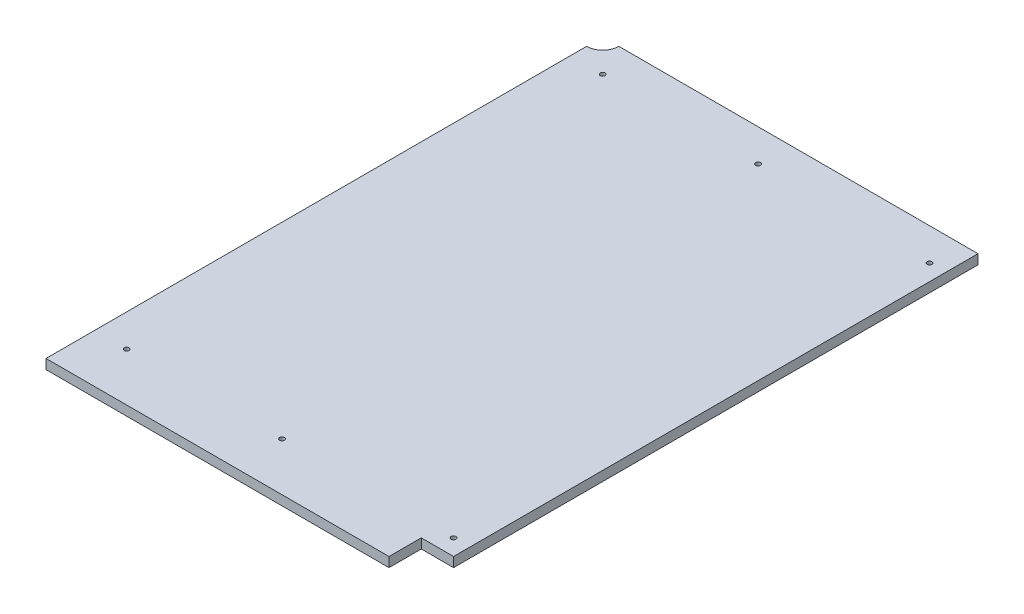
ISO-10303-21;
HEADER;
FILE_DESCRIPTION(('STEP AP214'),'2;1');
FILE_NAME('part.step','',(''),(''),'','','');
FILE_SCHEMA(('AUTOMOTIVE_DESIGN { 1 0 10303 214 1 1 1 1 }'));
ENDSEC;
DATA;
#1=APPLICATION_CONTEXT('core data for automotive mechanical design processes');
#2=APPLICATION_PROTOCOL_DEFINITION('international standard','automotive_design',2000,#1);
#3=PRODUCT_CONTEXT('',#1,'mechanical');
#4=PRODUCT('Part','Part','',(#3));
#5=PRODUCT_RELATED_PRODUCT_CATEGORY('part','',(#4));
#6=PRODUCT_DEFINITION_FORMATION('','',#4);
#7=PRODUCT_DEFINITION_CONTEXT('part definition',#1,'design');
#8=PRODUCT_DEFINITION('design','',#6,#7);
#9=PRODUCT_DEFINITION_SHAPE('','',#8);
#10=(LENGTH_UNIT() NAMED_UNIT(*) SI_UNIT(.MILLI.,.METRE.));
#11=(NAMED_UNIT(*) PLANE_ANGLE_UNIT() SI_UNIT($,.RADIAN.));
#12=(NAMED_UNIT(*) SI_UNIT($,.STERADIAN.) SOLID_ANGLE_UNIT());
#13=UNCERTAINTY_MEASURE_WITH_UNIT(LENGTH_MEASURE(1.E-05),#10,'distance_accuracy_value','');
#14=(GEOMETRIC_REPRESENTATION_CONTEXT(3) GLOBAL_UNCERTAINTY_ASSIGNED_CONTEXT((#13)) GLOBAL_UNIT_ASSIGNED_CONTEXT((#10,
#11,#12)) REPRESENTATION_CONTEXT('',''));
#15=CARTESIAN_POINT('',(0.,0.,0.));
#16=DIRECTION('',(0.,0.,1.));
#17=DIRECTION('',(1.,0.,0.));
#18=AXIS2_PLACEMENT_3D('',#15,#16,#17);
#19=CARTESIAN_POINT('',(-112.725,6.,-113.5));
#20=DIRECTION('',(0.,1.,0.));
#21=DIRECTION('',(0.,0.,1.));
#22=AXIS2_PLACEMENT_3D('',#19,#20,#21);
#23=PLANE('',#22);
#24=CARTESIAN_POINT('',(3.55000000000004,6.,201.5));
#25=DIRECTION('',(0.,1.,0.));
#26=DIRECTION('',(0.,0.,1.));
#27=AXIS2_PLACEMENT_3D('',#24,#25,#26);
#28=CIRCLE('',#27,1.5);
#29=CARTESIAN_POINT('',(3.55000000000004,6.,203.));
#30=VERTEX_POINT('',#29);
#31=EDGE_CURVE('E185',#30,#30,#28,.T.);
#32=ORIENTED_EDGE('',*,*,#31,.F.);
#33=EDGE_LOOP('',(#32));
#34=FACE_BOUND('',#33,.T.);
#35=CARTESIAN_POINT('',(3.55,6.,-93.5));
#36=DIRECTION('',(0.,1.,0.));
#37=DIRECTION('',(0.,0.,1.));
#38=AXIS2_PLACEMENT_3D('',#35,#36,#37);
#39=CIRCLE('',#38,1.5);
#40=CARTESIAN_POINT('',(3.55,6.,-92.));
#41=VERTEX_POINT('',#40);
#42=EDGE_CURVE('E173',#41,#41,#39,.T.);
#43=ORIENTED_EDGE('',*,*,#42,.F.);
#44=EDGE_LOOP('',(#43));
#45=FACE_BOUND('',#44,.T.);
#46=CARTESIAN_POINT('',(-92.725,6.,-93.5));
#47=DIRECTION('',(0.,1.,0.));
#48=DIRECTION('',(0.,0.,1.));
#49=AXIS2_PLACEMENT_3D('',#46,#47,#48);
#50=CIRCLE('',#49,1.5);
#51=CARTESIAN_POINT('',(-92.725,6.,-92.));
#52=VERTEX_POINT('',#51);
#53=EDGE_CURVE('E128',#52,#52,#50,.T.);
#54=ORIENTED_EDGE('',*,*,#53,.F.);
#55=EDGE_LOOP('',(#54));
#56=FACE_BOUND('',#55,.T.);
#57=DIRECTION('',(1.,0.,0.));
#58=VECTOR('',#57,1.);
#59=CARTESIAN_POINT('',(-112.725,6.,231.5));
#60=LINE('',#59,#58);
#61=CARTESIAN_POINT('',(-112.725,6.,231.5));
#62=VERTEX_POINT('',#61);
#63=CARTESIAN_POINT('',(99.825,6.,231.5));
#64=VERTEX_POINT('',#63);
#65=EDGE_CURVE('E87',#62,#64,#60,.T.);
#66=ORIENTED_EDGE('',*,*,#65,.T.);
#67=DIRECTION('',(0.,0.,-1.));
#68=VECTOR('',#67,1.);
#69=CARTESIAN_POINT('',(99.825,6.,231.5));
#70=LINE('',#69,#68);
#71=CARTESIAN_POINT('',(99.825,6.,211.5));
#72=VERTEX_POINT('',#71);
#73=EDGE_CURVE('E159',#64,#72,#70,.T.);
#74=ORIENTED_EDGE('',*,*,#73,.T.);
#75=DIRECTION('',(1.,0.,0.));
#76=VECTOR('',#75,1.);
#77=CARTESIAN_POINT('',(99.825,6.,211.5));
#78=LINE('',#77,#76);
#79=CARTESIAN_POINT('',(119.825,6.,211.5));
#80=VERTEX_POINT('',#79);
#81=EDGE_CURVE('E151',#72,#80,#78,.T.);
#82=ORIENTED_EDGE('',*,*,#81,.T.);
#83=DIRECTION('',(0.,0.,-1.));
#84=VECTOR('',#83,1.);
#85=CARTESIAN_POINT('',(119.825,6.,-113.5));
#86=LINE('',#85,#84);
#87=CARTESIAN_POINT('',(119.825,6.,-113.5));
#88=VERTEX_POINT('',#87);
#89=EDGE_CURVE('E105',#80,#88,#86,.T.);
#90=ORIENTED_EDGE('',*,*,#89,.T.);
#91=DIRECTION('',(-1.,0.,0.));
#92=VECTOR('',#91,1.);
#93=CARTESIAN_POINT('',(-102.725,6.,-113.5));
#94=LINE('',#93,#92);
#95=CARTESIAN_POINT('',(-102.725,6.,-113.5));
#96=VERTEX_POINT('',#95);
#97=EDGE_CURVE('E98',#88,#96,#94,.T.);
#98=ORIENTED_EDGE('',*,*,#97,.T.);
#99=CARTESIAN_POINT('',(-112.725,6.,-113.5));
#100=DIRECTION('',(0.,-1.,0.));
#101=DIRECTION('',(0.,0.,1.));
#102=AXIS2_PLACEMENT_3D('',#99,#100,#101);
#103=CIRCLE('',#102,9.99999999999999);
#104=CARTESIAN_POINT('',(-112.725,6.,-103.5));
#105=VERTEX_POINT('',#104);
#106=EDGE_CURVE('E102',#96,#105,#103,.T.);
#107=ORIENTED_EDGE('',*,*,#106,.T.);
#108=DIRECTION('',(0.,0.,1.));
#109=VECTOR('',#108,1.);
#110=CARTESIAN_POINT('',(-112.725,6.,-103.5));
#111=LINE('',#110,#109);
#112=EDGE_CURVE('E52',#105,#62,#111,.T.);
#113=ORIENTED_EDGE('',*,*,#112,.T.);
#114=EDGE_LOOP('',(#66,#74,#82,#90,#98,#107,#113));
#115=FACE_BOUND('',#114,.T.);
#116=CARTESIAN_POINT('',(109.825,6.,-93.5));
#117=DIRECTION('',(0.,1.,0.));
#118=DIRECTION('',(0.,0.,1.));
#119=AXIS2_PLACEMENT_3D('',#116,#117,#118);
#120=CIRCLE('',#119,1.5);
#121=CARTESIAN_POINT('',(109.825,6.,-92.));
#122=VERTEX_POINT('',#121);
#123=EDGE_CURVE('E167',#122,#122,#120,.T.);
#124=ORIENTED_EDGE('',*,*,#123,.F.);
#125=EDGE_LOOP('',(#124));
#126=FACE_BOUND('',#125,.T.);
#127=CARTESIAN_POINT('',(-92.725,6.,201.5));
#128=DIRECTION('',(0.,1.,0.));
#129=DIRECTION('',(0.,0.,1.));
#130=AXIS2_PLACEMENT_3D('',#127,#128,#129);
#131=CIRCLE('',#130,1.5);
#132=CARTESIAN_POINT('',(-92.725,6.,203.));
#133=VERTEX_POINT('',#132);
#134=EDGE_CURVE('E179',#133,#133,#131,.T.);
#135=ORIENTED_EDGE('',*,*,#134,.F.);
#136=EDGE_LOOP('',(#135));
#137=FACE_BOUND('',#136,.T.);
#138=CARTESIAN_POINT('',(109.825,6.,201.5));
#139=DIRECTION('',(0.,1.,0.));
#140=DIRECTION('',(0.,0.,1.));
#141=AXIS2_PLACEMENT_3D('',#138,#139,#140);
#142=CIRCLE('',#141,1.5);
#143=CARTESIAN_POINT('',(109.825,6.,203.));
#144=VERTEX_POINT('',#143);
#145=EDGE_CURVE('E191',#144,#144,#142,.T.);
#146=ORIENTED_EDGE('',*,*,#145,.F.);
#147=EDGE_LOOP('',(#146));
#148=FACE_BOUND('',#147,.T.);
#149=ADVANCED_FACE('F35',(#34,#45,#56,#115,#126,#137,#148),#23,.T.);
#150=CARTESIAN_POINT('',(-112.725,0.,-113.5));
#151=DIRECTION('',(0.,1.,0.));
#152=DIRECTION('',(0.,0.,1.));
#153=AXIS2_PLACEMENT_3D('',#150,#151,#152);
#154=PLANE('',#153);
#155=DIRECTION('',(1.,0.,0.));
#156=VECTOR('',#155,1.);
#157=CARTESIAN_POINT('',(-102.725,0.,231.5));
#158=LINE('',#157,#156);
#159=CARTESIAN_POINT('',(-112.725,0.,231.5));
#160=VERTEX_POINT('',#159);
#161=CARTESIAN_POINT('',(99.825,0.,231.5));
#162=VERTEX_POINT('',#161);
#163=EDGE_CURVE('E82',#160,#162,#158,.T.);
#164=ORIENTED_EDGE('',*,*,#163,.F.);
#165=DIRECTION('',(0.,0.,1.));
#166=VECTOR('',#165,1.);
#167=CARTESIAN_POINT('',(-112.725,0.,221.5));
#168=LINE('',#167,#166);
#169=CARTESIAN_POINT('',(-112.725,0.,-103.5));
#170=VERTEX_POINT('',#169);
#171=EDGE_CURVE('E78',#170,#160,#168,.T.);
#172=ORIENTED_EDGE('',*,*,#171,.F.);
#173=CARTESIAN_POINT('',(-112.725,0.,-113.5));
#174=DIRECTION('',(0.,-1.,0.));
#175=DIRECTION('',(0.,0.,1.));
#176=AXIS2_PLACEMENT_3D('',#173,#174,#175);
#177=CIRCLE('',#176,9.99999999999999);
#178=CARTESIAN_POINT('',(-102.725,0.,-113.5));
#179=VERTEX_POINT('',#178);
#180=EDGE_CURVE('E135',#179,#170,#177,.T.);
#181=ORIENTED_EDGE('',*,*,#180,.F.);
#182=DIRECTION('',(-1.,0.,0.));
#183=VECTOR('',#182,1.);
#184=CARTESIAN_POINT('',(-102.725,0.,-113.5));
#185=LINE('',#184,#183);
#186=CARTESIAN_POINT('',(119.825,0.,-113.5));
#187=VERTEX_POINT('',#186);
#188=EDGE_CURVE('E114',#187,#179,#185,.T.);
#189=ORIENTED_EDGE('',*,*,#188,.F.);
#190=DIRECTION('',(0.,0.,-1.));
#191=VECTOR('',#190,1.);
#192=CARTESIAN_POINT('',(119.825,0.,-113.5));
#193=LINE('',#192,#191);
#194=CARTESIAN_POINT('',(119.825,0.,211.5));
#195=VERTEX_POINT('',#194);
#196=EDGE_CURVE('E132',#195,#187,#193,.T.);
#197=ORIENTED_EDGE('',*,*,#196,.F.);
#198=DIRECTION('',(1.,0.,0.));
#199=VECTOR('',#198,1.);
#200=CARTESIAN_POINT('',(99.825,0.,211.5));
#201=LINE('',#200,#199);
#202=CARTESIAN_POINT('',(99.825,0.,211.5));
#203=VERTEX_POINT('',#202);
#204=EDGE_CURVE('E130',#203,#195,#201,.T.);
#205=ORIENTED_EDGE('',*,*,#204,.F.);
#206=DIRECTION('',(0.,0.,-1.));
#207=VECTOR('',#206,1.);
#208=CARTESIAN_POINT('',(99.825,0.,231.5));
#209=LINE('',#208,#207);
#210=EDGE_CURVE('E127',#162,#203,#209,.T.);
#211=ORIENTED_EDGE('',*,*,#210,.F.);
#212=EDGE_LOOP('',(#164,#172,#181,#189,#197,#205,#211));
#213=FACE_BOUND('',#212,.T.);
#214=CARTESIAN_POINT('',(-92.725,0.,-93.5));
#215=DIRECTION('',(0.,1.,0.));
#216=DIRECTION('',(0.,0.,1.));
#217=AXIS2_PLACEMENT_3D('',#214,#215,#216);
#218=CIRCLE('',#217,1.5);
#219=CARTESIAN_POINT('',(-92.725,0.,-92.));
#220=VERTEX_POINT('',#219);
#221=EDGE_CURVE('E164',#220,#220,#218,.T.);
#222=ORIENTED_EDGE('',*,*,#221,.T.);
#223=EDGE_LOOP('',(#222));
#224=FACE_BOUND('',#223,.T.);
#225=CARTESIAN_POINT('',(109.825,0.,-93.5));
#226=DIRECTION('',(0.,1.,0.));
#227=DIRECTION('',(0.,0.,1.));
#228=AXIS2_PLACEMENT_3D('',#225,#226,#227);
#229=CIRCLE('',#228,1.5);
#230=CARTESIAN_POINT('',(109.825,0.,-92.));
#231=VERTEX_POINT('',#230);
#232=EDGE_CURVE('E170',#231,#231,#229,.T.);
#233=ORIENTED_EDGE('',*,*,#232,.T.);
#234=EDGE_LOOP('',(#233));
#235=FACE_BOUND('',#234,.T.);
#236=CARTESIAN_POINT('',(3.55,0.,-93.5));
#237=DIRECTION('',(0.,1.,0.));
#238=DIRECTION('',(0.,0.,1.));
#239=AXIS2_PLACEMENT_3D('',#236,#237,#238);
#240=CIRCLE('',#239,1.5);
#241=CARTESIAN_POINT('',(3.55,0.,-92.));
#242=VERTEX_POINT('',#241);
#243=EDGE_CURVE('E176',#242,#242,#240,.T.);
#244=ORIENTED_EDGE('',*,*,#243,.T.);
#245=EDGE_LOOP('',(#244));
#246=FACE_BOUND('',#245,.T.);
#247=CARTESIAN_POINT('',(-92.725,0.,201.5));
#248=DIRECTION('',(0.,1.,0.));
#249=DIRECTION('',(0.,0.,1.));
#250=AXIS2_PLACEMENT_3D('',#247,#248,#249);
#251=CIRCLE('',#250,1.5);
#252=CARTESIAN_POINT('',(-92.725,0.,203.));
#253=VERTEX_POINT('',#252);
#254=EDGE_CURVE('E182',#253,#253,#251,.T.);
#255=ORIENTED_EDGE('',*,*,#254,.T.);
#256=EDGE_LOOP('',(#255));
#257=FACE_BOUND('',#256,.T.);
#258=CARTESIAN_POINT('',(3.55000000000004,0.,201.5));
#259=DIRECTION('',(0.,1.,0.));
#260=DIRECTION('',(0.,0.,1.));
#261=AXIS2_PLACEMENT_3D('',#258,#259,#260);
#262=CIRCLE('',#261,1.5);
#263=CARTESIAN_POINT('',(3.55000000000004,0.,203.));
#264=VERTEX_POINT('',#263);
#265=EDGE_CURVE('E188',#264,#264,#262,.T.);
#266=ORIENTED_EDGE('',*,*,#265,.T.);
#267=EDGE_LOOP('',(#266));
#268=FACE_BOUND('',#267,.T.);
#269=CARTESIAN_POINT('',(109.825,0.,201.5));
#270=DIRECTION('',(0.,1.,0.));
#271=DIRECTION('',(0.,0.,1.));
#272=AXIS2_PLACEMENT_3D('',#269,#270,#271);
#273=CIRCLE('',#272,1.5);
#274=CARTESIAN_POINT('',(109.825,0.,203.));
#275=VERTEX_POINT('',#274);
#276=EDGE_CURVE('E194',#275,#275,#273,.T.);
#277=ORIENTED_EDGE('',*,*,#276,.T.);
#278=EDGE_LOOP('',(#277));
#279=FACE_BOUND('',#278,.T.);
#280=ADVANCED_FACE('F155',(#213,#224,#235,#246,#257,#268,#279),#154,.F.);
#281=CARTESIAN_POINT('',(-102.725,6.,231.5));
#282=DIRECTION('',(0.,0.,-1.));
#283=DIRECTION('',(-1.,0.,0.));
#284=AXIS2_PLACEMENT_3D('',#281,#282,#283);
#285=PLANE('',#284);
#286=ORIENTED_EDGE('',*,*,#163,.T.);
#287=DIRECTION('',(0.,-1.,0.));
#288=VECTOR('',#287,1.);
#289=CARTESIAN_POINT('',(99.825,6.,231.5));
#290=LINE('',#289,#288);
#291=EDGE_CURVE('E11',#64,#162,#290,.T.);
#292=ORIENTED_EDGE('',*,*,#291,.F.);
#293=ORIENTED_EDGE('',*,*,#65,.F.);
#294=DIRECTION('',(0.,-1.,0.));
#295=VECTOR('',#294,1.);
#296=CARTESIAN_POINT('',(-112.725,6.,231.5));
#297=LINE('',#296,#295);
#298=EDGE_CURVE('E122',#62,#160,#297,.T.);
#299=ORIENTED_EDGE('',*,*,#298,.T.);
#300=EDGE_LOOP('',(#286,#292,#293,#299));
#301=FACE_BOUND('',#300,.T.);
#302=ADVANCED_FACE('F37',(#301),#285,.F.);
#303=CARTESIAN_POINT('',(99.825,6.,231.5));
#304=DIRECTION('',(-1.,0.,0.));
#305=DIRECTION('',(0.,0.,1.));
#306=AXIS2_PLACEMENT_3D('',#303,#304,#305);
#307=PLANE('',#306);
#308=ORIENTED_EDGE('',*,*,#210,.T.);
#309=DIRECTION('',(0.,-1.,0.));
#310=VECTOR('',#309,1.);
#311=CARTESIAN_POINT('',(99.825,6.,211.5));
#312=LINE('',#311,#310);
#313=EDGE_CURVE('E44',#72,#203,#312,.T.);
#314=ORIENTED_EDGE('',*,*,#313,.F.);
#315=ORIENTED_EDGE('',*,*,#73,.F.);
#316=ORIENTED_EDGE('',*,*,#291,.T.);
#317=EDGE_LOOP('',(#308,#314,#315,#316));
#318=FACE_BOUND('',#317,.T.);
#319=ADVANCED_FACE('F227',(#318),#307,.F.);
#320=CARTESIAN_POINT('',(99.825,6.,211.5));
#321=DIRECTION('',(0.,0.,-1.));
#322=DIRECTION('',(-1.,0.,0.));
#323=AXIS2_PLACEMENT_3D('',#320,#321,#322);
#324=PLANE('',#323);
#325=ORIENTED_EDGE('',*,*,#204,.T.);
#326=DIRECTION('',(0.,-1.,0.));
#327=VECTOR('',#326,1.);
#328=CARTESIAN_POINT('',(119.825,6.,211.5));
#329=LINE('',#328,#327);
#330=EDGE_CURVE('E142',#80,#195,#329,.T.);
#331=ORIENTED_EDGE('',*,*,#330,.F.);
#332=ORIENTED_EDGE('',*,*,#81,.F.);
#333=ORIENTED_EDGE('',*,*,#313,.T.);
#334=EDGE_LOOP('',(#325,#331,#332,#333));
#335=FACE_BOUND('',#334,.T.);
#336=ADVANCED_FACE('F149',(#335),#324,.F.);
#337=CARTESIAN_POINT('',(119.825,6.,-113.5));
#338=DIRECTION('',(-1.,0.,0.));
#339=DIRECTION('',(0.,0.,1.));
#340=AXIS2_PLACEMENT_3D('',#337,#338,#339);
#341=PLANE('',#340);
#342=ORIENTED_EDGE('',*,*,#196,.T.);
#343=DIRECTION('',(0.,-1.,0.));
#344=VECTOR('',#343,1.);
#345=CARTESIAN_POINT('',(119.825,6.,-113.5));
#346=LINE('',#345,#344);
#347=EDGE_CURVE('E116',#88,#187,#346,.T.);
#348=ORIENTED_EDGE('',*,*,#347,.F.);
#349=ORIENTED_EDGE('',*,*,#89,.F.);
#350=ORIENTED_EDGE('',*,*,#330,.T.);
#351=EDGE_LOOP('',(#342,#348,#349,#350));
#352=FACE_BOUND('',#351,.T.);
#353=ADVANCED_FACE('F158',(#352),#341,.F.);
#354=CARTESIAN_POINT('',(-102.725,6.,-113.5));
#355=DIRECTION('',(0.,0.,1.));
#356=DIRECTION('',(1.,0.,0.));
#357=AXIS2_PLACEMENT_3D('',#354,#355,#356);
#358=PLANE('',#357);
#359=ORIENTED_EDGE('',*,*,#188,.T.);
#360=DIRECTION('',(0.,-1.,0.));
#361=VECTOR('',#360,1.);
#362=CARTESIAN_POINT('',(-102.725,6.,-113.5));
#363=LINE('',#362,#361);
#364=EDGE_CURVE('E111',#96,#179,#363,.T.);
#365=ORIENTED_EDGE('',*,*,#364,.F.);
#366=ORIENTED_EDGE('',*,*,#97,.F.);
#367=ORIENTED_EDGE('',*,*,#347,.T.);
#368=EDGE_LOOP('',(#359,#365,#366,#367));
#369=FACE_BOUND('',#368,.T.);
#370=ADVANCED_FACE('F112',(#369),#358,.F.);
#371=CARTESIAN_POINT('',(-112.725,6.,-113.5));
#372=DIRECTION('',(0.,-1.,0.));
#373=DIRECTION('',(0.,0.,-1.));
#374=AXIS2_PLACEMENT_3D('',#371,#372,#373);
#375=CYLINDRICAL_SURFACE('',#374,9.99999999999999);
#376=ORIENTED_EDGE('',*,*,#180,.T.);
#377=DIRECTION('',(0.,-1.,0.));
#378=VECTOR('',#377,1.);
#379=CARTESIAN_POINT('',(-112.725,6.,-103.5));
#380=LINE('',#379,#378);
#381=EDGE_CURVE('E117',#105,#170,#380,.T.);
#382=ORIENTED_EDGE('',*,*,#381,.F.);
#383=ORIENTED_EDGE('',*,*,#106,.F.);
#384=ORIENTED_EDGE('',*,*,#364,.T.);
#385=EDGE_LOOP('',(#376,#382,#383,#384));
#386=FACE_BOUND('',#385,.T.);
#387=ADVANCED_FACE('F119',(#386),#375,.F.);
#388=CARTESIAN_POINT('',(-112.725,6.,221.5));
#389=DIRECTION('',(1.,0.,0.));
#390=DIRECTION('',(0.,0.,-1.));
#391=AXIS2_PLACEMENT_3D('',#388,#389,#390);
#392=PLANE('',#391);
#393=ORIENTED_EDGE('',*,*,#171,.T.);
#394=ORIENTED_EDGE('',*,*,#298,.F.);
#395=ORIENTED_EDGE('',*,*,#112,.F.);
#396=ORIENTED_EDGE('',*,*,#381,.T.);
#397=EDGE_LOOP('',(#393,#394,#395,#396));
#398=FACE_BOUND('',#397,.T.);
#399=ADVANCED_FACE('F216',(#398),#392,.F.);
#400=CARTESIAN_POINT('',(-92.725,6.,-93.5));
#401=DIRECTION('',(0.,-1.,0.));
#402=DIRECTION('',(0.,0.,-1.));
#403=AXIS2_PLACEMENT_3D('',#400,#401,#402);
#404=CYLINDRICAL_SURFACE('',#403,1.5);
#405=ORIENTED_EDGE('',*,*,#53,.T.);
#406=EDGE_LOOP('',(#405));
#407=FACE_BOUND('',#406,.T.);
#408=ORIENTED_EDGE('',*,*,#221,.F.);
#409=EDGE_LOOP('',(#408));
#410=FACE_BOUND('',#409,.T.);
#411=ADVANCED_FACE('F213',(#407,#410),#404,.F.);
#412=CARTESIAN_POINT('',(109.825,6.,-93.5));
#413=DIRECTION('',(0.,-1.,0.));
#414=DIRECTION('',(0.,0.,-1.));
#415=AXIS2_PLACEMENT_3D('',#412,#413,#414);
#416=CYLINDRICAL_SURFACE('',#415,1.5);
#417=ORIENTED_EDGE('',*,*,#123,.T.);
#418=EDGE_LOOP('',(#417));
#419=FACE_BOUND('',#418,.T.);
#420=ORIENTED_EDGE('',*,*,#232,.F.);
#421=EDGE_LOOP('',(#420));
#422=FACE_BOUND('',#421,.T.);
#423=ADVANCED_FACE('F290',(#419,#422),#416,.F.);
#424=CARTESIAN_POINT('',(3.55,6.,-93.5));
#425=DIRECTION('',(0.,-1.,0.));
#426=DIRECTION('',(0.,0.,-1.));
#427=AXIS2_PLACEMENT_3D('',#424,#425,#426);
#428=CYLINDRICAL_SURFACE('',#427,1.5);
#429=ORIENTED_EDGE('',*,*,#42,.T.);
#430=EDGE_LOOP('',(#429));
#431=FACE_BOUND('',#430,.T.);
#432=ORIENTED_EDGE('',*,*,#243,.F.);
#433=EDGE_LOOP('',(#432));
#434=FACE_BOUND('',#433,.T.);
#435=ADVANCED_FACE('F298',(#431,#434),#428,.F.);
#436=CARTESIAN_POINT('',(-92.725,6.,201.5));
#437=DIRECTION('',(0.,-1.,0.));
#438=DIRECTION('',(0.,0.,-1.));
#439=AXIS2_PLACEMENT_3D('',#436,#437,#438);
#440=CYLINDRICAL_SURFACE('',#439,1.5);
#441=ORIENTED_EDGE('',*,*,#134,.T.);
#442=EDGE_LOOP('',(#441));
#443=FACE_BOUND('',#442,.T.);
#444=ORIENTED_EDGE('',*,*,#254,.F.);
#445=EDGE_LOOP('',(#444));
#446=FACE_BOUND('',#445,.T.);
#447=ADVANCED_FACE('F306',(#443,#446),#440,.F.);
#448=CARTESIAN_POINT('',(3.55000000000004,6.,201.5));
#449=DIRECTION('',(0.,-1.,0.));
#450=DIRECTION('',(0.,0.,-1.));
#451=AXIS2_PLACEMENT_3D('',#448,#449,#450);
#452=CYLINDRICAL_SURFACE('',#451,1.5);
#453=ORIENTED_EDGE('',*,*,#31,.T.);
#454=EDGE_LOOP('',(#453));
#455=FACE_BOUND('',#454,.T.);
#456=ORIENTED_EDGE('',*,*,#265,.F.);
#457=EDGE_LOOP('',(#456));
#458=FACE_BOUND('',#457,.T.);
#459=ADVANCED_FACE('F315',(#455,#458),#452,.F.);
#460=CARTESIAN_POINT('',(109.825,6.,201.5));
#461=DIRECTION('',(0.,-1.,0.));
#462=DIRECTION('',(0.,0.,-1.));
#463=AXIS2_PLACEMENT_3D('',#460,#461,#462);
#464=CYLINDRICAL_SURFACE('',#463,1.5);
#465=ORIENTED_EDGE('',*,*,#145,.T.);
#466=EDGE_LOOP('',(#465));
#467=FACE_BOUND('',#466,.T.);
#468=ORIENTED_EDGE('',*,*,#276,.F.);
#469=EDGE_LOOP('',(#468));
#470=FACE_BOUND('',#469,.T.);
#471=ADVANCED_FACE('F200',(#467,#470),#464,.F.);
#472=CLOSED_SHELL('',(#149,#280,#302,#319,#336,#353,#370,#387,#399,#411,#423,#435,#447,#459,#471));
#473=MANIFOLD_SOLID_BREP('B2',#472);
#474=ADVANCED_BREP_SHAPE_REPRESENTATION('',(#18,#473),#14);
#475=SHAPE_DEFINITION_REPRESENTATION(#9,#474);
ENDSEC;
END-ISO-10303-21;
